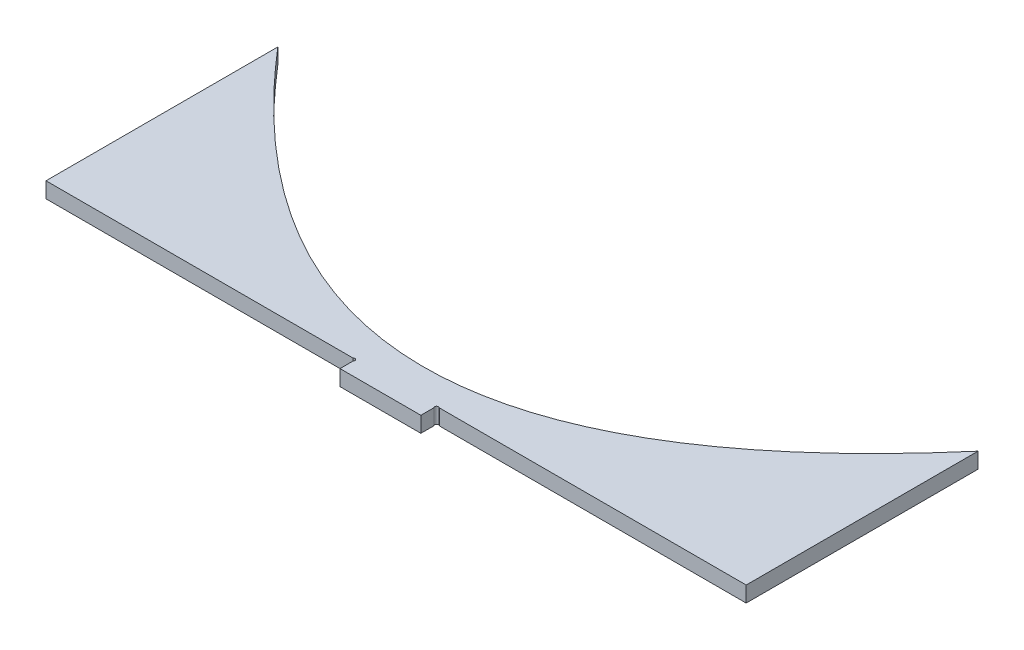
ISO-10303-21;
HEADER;
FILE_DESCRIPTION(('STEP AP214'),'2;1');
FILE_NAME('part.step','',(''),(''),'','','');
FILE_SCHEMA(('AUTOMOTIVE_DESIGN { 1 0 10303 214 1 1 1 1 }'));
ENDSEC;
DATA;
#1=APPLICATION_CONTEXT('core data for automotive mechanical design processes');
#2=APPLICATION_PROTOCOL_DEFINITION('international standard','automotive_design',2000,#1);
#3=PRODUCT_CONTEXT('',#1,'mechanical');
#4=PRODUCT('Part','Part','',(#3));
#5=PRODUCT_RELATED_PRODUCT_CATEGORY('part','',(#4));
#6=PRODUCT_DEFINITION_FORMATION('','',#4);
#7=PRODUCT_DEFINITION_CONTEXT('part definition',#1,'design');
#8=PRODUCT_DEFINITION('design','',#6,#7);
#9=PRODUCT_DEFINITION_SHAPE('','',#8);
#10=(LENGTH_UNIT() NAMED_UNIT(*) SI_UNIT(.MILLI.,.METRE.));
#11=(NAMED_UNIT(*) PLANE_ANGLE_UNIT() SI_UNIT($,.RADIAN.));
#12=(NAMED_UNIT(*) SI_UNIT($,.STERADIAN.) SOLID_ANGLE_UNIT());
#13=UNCERTAINTY_MEASURE_WITH_UNIT(LENGTH_MEASURE(1.E-05),#10,'distance_accuracy_value','');
#14=(GEOMETRIC_REPRESENTATION_CONTEXT(3) GLOBAL_UNCERTAINTY_ASSIGNED_CONTEXT((#13)) GLOBAL_UNIT_ASSIGNED_CONTEXT((#10,
#11,#12)) REPRESENTATION_CONTEXT('',''));
#15=CARTESIAN_POINT('',(0.,0.,0.));
#16=DIRECTION('',(0.,0.,1.));
#17=DIRECTION('',(1.,0.,0.));
#18=AXIS2_PLACEMENT_3D('',#15,#16,#17);
#19=CARTESIAN_POINT('',(-237.438208893054,12.,9.10637344164962));
#20=DIRECTION('',(0.,0.,-1.));
#21=DIRECTION('',(-1.,0.,0.));
#22=AXIS2_PLACEMENT_3D('',#19,#20,#21);
#23=PLANE('',#22);
#24=DIRECTION('',(1.,0.,0.));
#25=VECTOR('',#24,1.);
#26=CARTESIAN_POINT('',(-237.438208893054,0.,9.10637344164962));
#27=LINE('',#26,#25);
#28=CARTESIAN_POINT('',(-237.438208893054,0.,9.10637344164962));
#29=VERTEX_POINT('',#28);
#30=CARTESIAN_POINT('',(-2.12132034355962,0.,9.10637344164962));
#31=VERTEX_POINT('',#30);
#32=EDGE_CURVE('E189',#29,#31,#27,.T.);
#33=ORIENTED_EDGE('',*,*,#32,.T.);
#34=DIRECTION('',(0.,-1.,0.));
#35=VECTOR('',#34,1.);
#36=CARTESIAN_POINT('',(-2.12132034355962,12.,9.10637344164962));
#37=LINE('',#36,#35);
#38=CARTESIAN_POINT('',(-2.12132034355962,12.,9.10637344164962));
#39=VERTEX_POINT('',#38);
#40=EDGE_CURVE('E11',#39,#31,#37,.T.);
#41=ORIENTED_EDGE('',*,*,#40,.F.);
#42=DIRECTION('',(1.,0.,0.));
#43=VECTOR('',#42,1.);
#44=CARTESIAN_POINT('',(-237.438208893054,12.,9.10637344164962));
#45=LINE('',#44,#43);
#46=CARTESIAN_POINT('',(-237.438208893054,12.,9.10637344164962));
#47=VERTEX_POINT('',#46);
#48=EDGE_CURVE('E216',#47,#39,#45,.T.);
#49=ORIENTED_EDGE('',*,*,#48,.F.);
#50=DIRECTION('',(0.,-1.,0.));
#51=VECTOR('',#50,1.);
#52=CARTESIAN_POINT('',(-237.438208893054,12.,9.10637344164962));
#53=LINE('',#52,#51);
#54=EDGE_CURVE('E137',#47,#29,#53,.T.);
#55=ORIENTED_EDGE('',*,*,#54,.T.);
#56=EDGE_LOOP('',(#33,#41,#49,#55));
#57=FACE_BOUND('',#56,.T.);
#58=ADVANCED_FACE('F33',(#57),#23,.F.);
#59=CARTESIAN_POINT('',(-1.06066017177981,12.,10.1670336134294));
#60=DIRECTION('',(0.,-1.,0.));
#61=DIRECTION('',(0.,0.,-1.));
#62=AXIS2_PLACEMENT_3D('',#59,#60,#61);
#63=CYLINDRICAL_SURFACE('',#62,1.5);
#64=CARTESIAN_POINT('',(-1.06066017177981,0.,10.1670336134294));
#65=DIRECTION('',(0.,-1.,0.));
#66=DIRECTION('',(0.,0.,1.));
#67=AXIS2_PLACEMENT_3D('',#64,#65,#66);
#68=CIRCLE('',#67,1.5);
#69=CARTESIAN_POINT('',(0.,0.,11.2276937852093));
#70=VERTEX_POINT('',#69);
#71=EDGE_CURVE('E180',#31,#70,#68,.T.);
#72=ORIENTED_EDGE('',*,*,#71,.T.);
#73=DIRECTION('',(0.,-1.,0.));
#74=VECTOR('',#73,1.);
#75=CARTESIAN_POINT('',(0.,12.,11.2276937852093));
#76=LINE('',#75,#74);
#77=CARTESIAN_POINT('',(0.,12.,11.2276937852093));
#78=VERTEX_POINT('',#77);
#79=EDGE_CURVE('E41',#78,#70,#76,.T.);
#80=ORIENTED_EDGE('',*,*,#79,.F.);
#81=CARTESIAN_POINT('',(-1.06066017177981,12.,10.1670336134294));
#82=DIRECTION('',(0.,-1.,0.));
#83=DIRECTION('',(0.,0.,1.));
#84=AXIS2_PLACEMENT_3D('',#81,#82,#83);
#85=CIRCLE('',#84,1.5);
#86=EDGE_CURVE('E97',#39,#78,#85,.T.);
#87=ORIENTED_EDGE('',*,*,#86,.F.);
#88=ORIENTED_EDGE('',*,*,#40,.T.);
#89=EDGE_LOOP('',(#72,#80,#87,#88));
#90=FACE_BOUND('',#89,.T.);
#91=ADVANCED_FACE('F173',(#90),#63,.F.);
#92=CARTESIAN_POINT('',(0.,12.,11.2276937852093));
#93=DIRECTION('',(1.,0.,0.));
#94=DIRECTION('',(0.,0.,-1.));
#95=AXIS2_PLACEMENT_3D('',#92,#93,#94);
#96=PLANE('',#95);
#97=DIRECTION('',(0.,0.,1.));
#98=VECTOR('',#97,1.);
#99=CARTESIAN_POINT('',(0.,0.,11.2276937852093));
#100=LINE('',#99,#98);
#101=CARTESIAN_POINT('',(0.,0.,21.1063734416496));
#102=VERTEX_POINT('',#101);
#103=EDGE_CURVE('E188',#70,#102,#100,.T.);
#104=ORIENTED_EDGE('',*,*,#103,.T.);
#105=DIRECTION('',(0.,-1.,0.));
#106=VECTOR('',#105,1.);
#107=CARTESIAN_POINT('',(0.,12.,21.1063734416496));
#108=LINE('',#107,#106);
#109=CARTESIAN_POINT('',(0.,12.,21.1063734416496));
#110=VERTEX_POINT('',#109);
#111=EDGE_CURVE('E195',#110,#102,#108,.T.);
#112=ORIENTED_EDGE('',*,*,#111,.F.);
#113=DIRECTION('',(0.,0.,1.));
#114=VECTOR('',#113,1.);
#115=CARTESIAN_POINT('',(0.,12.,11.2276937852093));
#116=LINE('',#115,#114);
#117=EDGE_CURVE('E194',#78,#110,#116,.T.);
#118=ORIENTED_EDGE('',*,*,#117,.F.);
#119=ORIENTED_EDGE('',*,*,#79,.T.);
#120=EDGE_LOOP('',(#104,#112,#118,#119));
#121=FACE_BOUND('',#120,.T.);
#122=ADVANCED_FACE('F170',(#121),#96,.F.);
#123=CARTESIAN_POINT('',(31.,12.,21.1063734416496));
#124=DIRECTION('',(0.,0.,-1.));
#125=DIRECTION('',(-1.,0.,0.));
#126=AXIS2_PLACEMENT_3D('',#123,#124,#125);
#127=PLANE('',#126);
#128=DIRECTION('',(1.,0.,0.));
#129=VECTOR('',#128,1.);
#130=CARTESIAN_POINT('',(31.,0.,21.1063734416496));
#131=LINE('',#130,#129);
#132=CARTESIAN_POINT('',(62.,0.,21.1063734416496));
#133=VERTEX_POINT('',#132);
#134=EDGE_CURVE('E198',#102,#133,#131,.T.);
#135=ORIENTED_EDGE('',*,*,#134,.T.);
#136=DIRECTION('',(0.,-1.,0.));
#137=VECTOR('',#136,1.);
#138=CARTESIAN_POINT('',(62.,12.,21.1063734416496));
#139=LINE('',#138,#137);
#140=CARTESIAN_POINT('',(62.,12.,21.1063734416496));
#141=VERTEX_POINT('',#140);
#142=EDGE_CURVE('E226',#141,#133,#139,.T.);
#143=ORIENTED_EDGE('',*,*,#142,.F.);
#144=DIRECTION('',(1.,0.,0.));
#145=VECTOR('',#144,1.);
#146=CARTESIAN_POINT('',(31.,12.,21.1063734416496));
#147=LINE('',#146,#145);
#148=EDGE_CURVE('E231',#110,#141,#147,.T.);
#149=ORIENTED_EDGE('',*,*,#148,.F.);
#150=ORIENTED_EDGE('',*,*,#111,.T.);
#151=EDGE_LOOP('',(#135,#143,#149,#150));
#152=FACE_BOUND('',#151,.T.);
#153=ADVANCED_FACE('F166',(#152),#127,.F.);
#154=CARTESIAN_POINT('',(62.,12.,21.1063734416496));
#155=DIRECTION('',(-1.,0.,0.));
#156=DIRECTION('',(0.,0.,1.));
#157=AXIS2_PLACEMENT_3D('',#154,#155,#156);
#158=PLANE('',#157);
#159=DIRECTION('',(0.,0.,-1.));
#160=VECTOR('',#159,1.);
#161=CARTESIAN_POINT('',(62.,0.,21.1063734416496));
#162=LINE('',#161,#160);
#163=CARTESIAN_POINT('',(62.,0.,11.2276937852093));
#164=VERTEX_POINT('',#163);
#165=EDGE_CURVE('E200',#133,#164,#162,.T.);
#166=ORIENTED_EDGE('',*,*,#165,.T.);
#167=DIRECTION('',(0.,-1.,0.));
#168=VECTOR('',#167,1.);
#169=CARTESIAN_POINT('',(62.,12.,11.2276937852093));
#170=LINE('',#169,#168);
#171=CARTESIAN_POINT('',(62.,12.,11.2276937852093));
#172=VERTEX_POINT('',#171);
#173=EDGE_CURVE('E223',#172,#164,#170,.T.);
#174=ORIENTED_EDGE('',*,*,#173,.F.);
#175=DIRECTION('',(0.,0.,-1.));
#176=VECTOR('',#175,1.);
#177=CARTESIAN_POINT('',(62.,12.,21.1063734416496));
#178=LINE('',#177,#176);
#179=EDGE_CURVE('E233',#141,#172,#178,.T.);
#180=ORIENTED_EDGE('',*,*,#179,.F.);
#181=ORIENTED_EDGE('',*,*,#142,.T.);
#182=EDGE_LOOP('',(#166,#174,#180,#181));
#183=FACE_BOUND('',#182,.T.);
#184=ADVANCED_FACE('F162',(#183),#158,.F.);
#185=CARTESIAN_POINT('',(63.0606601717799,12.,10.1670336134294));
#186=DIRECTION('',(0.,-1.,0.));
#187=DIRECTION('',(0.,0.,-1.));
#188=AXIS2_PLACEMENT_3D('',#185,#186,#187);
#189=CYLINDRICAL_SURFACE('',#188,1.50000000000002);
#190=CARTESIAN_POINT('',(63.0606601717799,0.,10.1670336134294));
#191=DIRECTION('',(0.,-1.,0.));
#192=DIRECTION('',(0.,0.,1.));
#193=AXIS2_PLACEMENT_3D('',#190,#191,#192);
#194=CIRCLE('',#193,1.50000000000002);
#195=CARTESIAN_POINT('',(64.1213203435597,0.,9.10637344164962));
#196=VERTEX_POINT('',#195);
#197=EDGE_CURVE('E204',#164,#196,#194,.T.);
#198=ORIENTED_EDGE('',*,*,#197,.T.);
#199=DIRECTION('',(0.,-1.,0.));
#200=VECTOR('',#199,1.);
#201=CARTESIAN_POINT('',(64.1213203435597,12.,9.10637344164962));
#202=LINE('',#201,#200);
#203=CARTESIAN_POINT('',(64.1213203435597,12.,9.10637344164962));
#204=VERTEX_POINT('',#203);
#205=EDGE_CURVE('E220',#204,#196,#202,.T.);
#206=ORIENTED_EDGE('',*,*,#205,.F.);
#207=CARTESIAN_POINT('',(63.0606601717799,12.,10.1670336134294));
#208=DIRECTION('',(0.,-1.,0.));
#209=DIRECTION('',(0.,0.,1.));
#210=AXIS2_PLACEMENT_3D('',#207,#208,#209);
#211=CIRCLE('',#210,1.50000000000002);
#212=EDGE_CURVE('E235',#172,#204,#211,.T.);
#213=ORIENTED_EDGE('',*,*,#212,.F.);
#214=ORIENTED_EDGE('',*,*,#173,.T.);
#215=EDGE_LOOP('',(#198,#206,#213,#214));
#216=FACE_BOUND('',#215,.T.);
#217=ADVANCED_FACE('F158',(#216),#189,.F.);
#218=CARTESIAN_POINT('',(64.1213203435597,12.,9.10637344164962));
#219=DIRECTION('',(0.,0.,-1.));
#220=DIRECTION('',(-1.,0.,0.));
#221=AXIS2_PLACEMENT_3D('',#218,#219,#220);
#222=PLANE('',#221);
#223=DIRECTION('',(1.,0.,0.));
#224=VECTOR('',#223,1.);
#225=CARTESIAN_POINT('',(64.1213203435597,0.,9.10637344164962));
#226=LINE('',#225,#224);
#227=CARTESIAN_POINT('',(299.438208893095,0.,9.10637344164962));
#228=VERTEX_POINT('',#227);
#229=EDGE_CURVE('E206',#196,#228,#226,.T.);
#230=ORIENTED_EDGE('',*,*,#229,.T.);
#231=DIRECTION('',(0.,-1.,0.));
#232=VECTOR('',#231,1.);
#233=CARTESIAN_POINT('',(299.438208893095,12.,9.10637344164962));
#234=LINE('',#233,#232);
#235=CARTESIAN_POINT('',(299.438208893095,12.,9.10637344164962));
#236=VERTEX_POINT('',#235);
#237=EDGE_CURVE('E132',#236,#228,#234,.T.);
#238=ORIENTED_EDGE('',*,*,#237,.F.);
#239=DIRECTION('',(1.,0.,0.));
#240=VECTOR('',#239,1.);
#241=CARTESIAN_POINT('',(64.1213203435597,12.,9.10637344164962));
#242=LINE('',#241,#240);
#243=EDGE_CURVE('E122',#204,#236,#242,.T.);
#244=ORIENTED_EDGE('',*,*,#243,.F.);
#245=ORIENTED_EDGE('',*,*,#205,.T.);
#246=EDGE_LOOP('',(#230,#238,#244,#245));
#247=FACE_BOUND('',#246,.T.);
#248=ADVANCED_FACE('F155',(#247),#222,.F.);
#249=CARTESIAN_POINT('',(299.438208893095,12.,9.10637344164962));
#250=DIRECTION('',(-1.,0.,0.));
#251=DIRECTION('',(0.,0.,1.));
#252=AXIS2_PLACEMENT_3D('',#249,#250,#251);
#253=PLANE('',#252);
#254=DIRECTION('',(0.,0.,-1.));
#255=VECTOR('',#254,1.);
#256=CARTESIAN_POINT('',(299.438208893095,0.,9.10637344164962));
#257=LINE('',#256,#255);
#258=CARTESIAN_POINT('',(299.438209014441,0.,-168.650156649656));
#259=VERTEX_POINT('',#258);
#260=EDGE_CURVE('E131',#228,#259,#257,.T.);
#261=ORIENTED_EDGE('',*,*,#260,.T.);
#262=DIRECTION('',(0.,-1.,0.));
#263=VECTOR('',#262,1.);
#264=CARTESIAN_POINT('',(299.438209014441,12.,-168.650156649656));
#265=LINE('',#264,#263);
#266=CARTESIAN_POINT('',(299.438209014441,12.,-168.650156649656));
#267=VERTEX_POINT('',#266);
#268=EDGE_CURVE('E128',#267,#259,#265,.T.);
#269=ORIENTED_EDGE('',*,*,#268,.F.);
#270=DIRECTION('',(0.,0.,-1.));
#271=VECTOR('',#270,1.);
#272=CARTESIAN_POINT('',(299.438208893095,12.,9.10637344164962));
#273=LINE('',#272,#271);
#274=EDGE_CURVE('E116',#236,#267,#273,.T.);
#275=ORIENTED_EDGE('',*,*,#274,.F.);
#276=ORIENTED_EDGE('',*,*,#237,.T.);
#277=EDGE_LOOP('',(#261,#269,#275,#276));
#278=FACE_BOUND('',#277,.T.);
#279=ADVANCED_FACE('F129',(#278),#253,.F.);
#280=CARTESIAN_POINT('',(21478.6105895272,12.,-1000012.));
#281=CARTESIAN_POINT('',(30.9999999999988,12.,999988.));
#282=CARTESIAN_POINT('',(-21416.6105895272,12.,-1000012.));
#283=B_SPLINE_CURVE_WITH_KNOTS('',2,(#280,#281,#282),.UNSPECIFIED.,.F.,.F.,(3,3),(0.,1.),.UNSPECIFIED.);
#284=DIRECTION('',(0.,-1.,0.));
#285=VECTOR('',#284,1.);
#286=SURFACE_OF_LINEAR_EXTRUSION('',#283,#285);
#287=CARTESIAN_POINT('',(21478.6105895272,0.,-1000012.));
#288=CARTESIAN_POINT('',(30.9999999999988,0.,999988.));
#289=CARTESIAN_POINT('',(-21416.6105895272,0.,-1000012.));
#290=B_SPLINE_CURVE_WITH_KNOTS('',2,(#287,#288,#289),.UNSPECIFIED.,.F.,.F.,(3,3),(0.,1.),.UNSPECIFIED.);
#291=CARTESIAN_POINT('',(-237.438208893054,0.,-168.650156508068));
#292=VERTEX_POINT('',#291);
#293=EDGE_CURVE('E83',#259,#292,#290,.T.);
#294=ORIENTED_EDGE('',*,*,#293,.T.);
#295=DIRECTION('',(0.,-1.,0.));
#296=VECTOR('',#295,1.);
#297=CARTESIAN_POINT('',(-237.438208893054,12.,-168.650156508068));
#298=LINE('',#297,#296);
#299=CARTESIAN_POINT('',(-237.438208893054,12.,-168.650156508068));
#300=VERTEX_POINT('',#299);
#301=EDGE_CURVE('E133',#300,#292,#298,.T.);
#302=ORIENTED_EDGE('',*,*,#301,.F.);
#303=EDGE_CURVE('E120',#267,#300,#283,.T.);
#304=ORIENTED_EDGE('',*,*,#303,.F.);
#305=ORIENTED_EDGE('',*,*,#268,.T.);
#306=EDGE_LOOP('',(#294,#302,#304,#305));
#307=FACE_BOUND('',#306,.T.);
#308=ADVANCED_FACE('F135',(#307),#286,.F.);
#309=CARTESIAN_POINT('',(-237.438208893054,12.,-168.650156508068));
#310=DIRECTION('',(1.,0.,0.));
#311=DIRECTION('',(0.,0.,-1.));
#312=AXIS2_PLACEMENT_3D('',#309,#310,#311);
#313=PLANE('',#312);
#314=DIRECTION('',(0.,0.,1.));
#315=VECTOR('',#314,1.);
#316=CARTESIAN_POINT('',(-237.438208893054,0.,-168.650156508068));
#317=LINE('',#316,#315);
#318=EDGE_CURVE('E89',#292,#29,#317,.T.);
#319=ORIENTED_EDGE('',*,*,#318,.T.);
#320=ORIENTED_EDGE('',*,*,#54,.F.);
#321=DIRECTION('',(0.,0.,1.));
#322=VECTOR('',#321,1.);
#323=CARTESIAN_POINT('',(-237.438208893054,12.,-168.650156508068));
#324=LINE('',#323,#322);
#325=EDGE_CURVE('E49',#300,#47,#324,.T.);
#326=ORIENTED_EDGE('',*,*,#325,.F.);
#327=ORIENTED_EDGE('',*,*,#301,.T.);
#328=EDGE_LOOP('',(#319,#320,#326,#327));
#329=FACE_BOUND('',#328,.T.);
#330=ADVANCED_FACE('F151',(#329),#313,.F.);
#331=CARTESIAN_POINT('',(-1.06066017177981,12.,10.1670336134294));
#332=DIRECTION('',(0.,1.,0.));
#333=DIRECTION('',(0.,0.,1.));
#334=AXIS2_PLACEMENT_3D('',#331,#332,#333);
#335=PLANE('',#334);
#336=ORIENTED_EDGE('',*,*,#48,.T.);
#337=ORIENTED_EDGE('',*,*,#86,.T.);
#338=ORIENTED_EDGE('',*,*,#117,.T.);
#339=ORIENTED_EDGE('',*,*,#148,.T.);
#340=ORIENTED_EDGE('',*,*,#179,.T.);
#341=ORIENTED_EDGE('',*,*,#212,.T.);
#342=ORIENTED_EDGE('',*,*,#243,.T.);
#343=ORIENTED_EDGE('',*,*,#274,.T.);
#344=ORIENTED_EDGE('',*,*,#303,.T.);
#345=ORIENTED_EDGE('',*,*,#325,.T.);
#346=EDGE_LOOP('',(#336,#337,#338,#339,#340,#341,#342,#343,#344,#345));
#347=FACE_BOUND('',#346,.T.);
#348=ADVANCED_FACE('F118',(#347),#335,.T.);
#349=CARTESIAN_POINT('',(-1.06066017177981,0.,10.1670336134294));
#350=DIRECTION('',(0.,1.,0.));
#351=DIRECTION('',(0.,0.,1.));
#352=AXIS2_PLACEMENT_3D('',#349,#350,#351);
#353=PLANE('',#352);
#354=ORIENTED_EDGE('',*,*,#32,.F.);
#355=ORIENTED_EDGE('',*,*,#318,.F.);
#356=ORIENTED_EDGE('',*,*,#293,.F.);
#357=ORIENTED_EDGE('',*,*,#260,.F.);
#358=ORIENTED_EDGE('',*,*,#229,.F.);
#359=ORIENTED_EDGE('',*,*,#197,.F.);
#360=ORIENTED_EDGE('',*,*,#165,.F.);
#361=ORIENTED_EDGE('',*,*,#134,.F.);
#362=ORIENTED_EDGE('',*,*,#103,.F.);
#363=ORIENTED_EDGE('',*,*,#71,.F.);
#364=EDGE_LOOP('',(#354,#355,#356,#357,#358,#359,#360,#361,#362,#363));
#365=FACE_BOUND('',#364,.T.);
#366=ADVANCED_FACE('F196',(#365),#353,.F.);
#367=CLOSED_SHELL('',(#58,#91,#122,#153,#184,#217,#248,#279,#308,#330,#348,#366));
#368=MANIFOLD_SOLID_BREP('B2',#367);
#369=ADVANCED_BREP_SHAPE_REPRESENTATION('',(#18,#368),#14);
#370=SHAPE_DEFINITION_REPRESENTATION(#9,#369);
ENDSEC;
END-ISO-10303-21;
